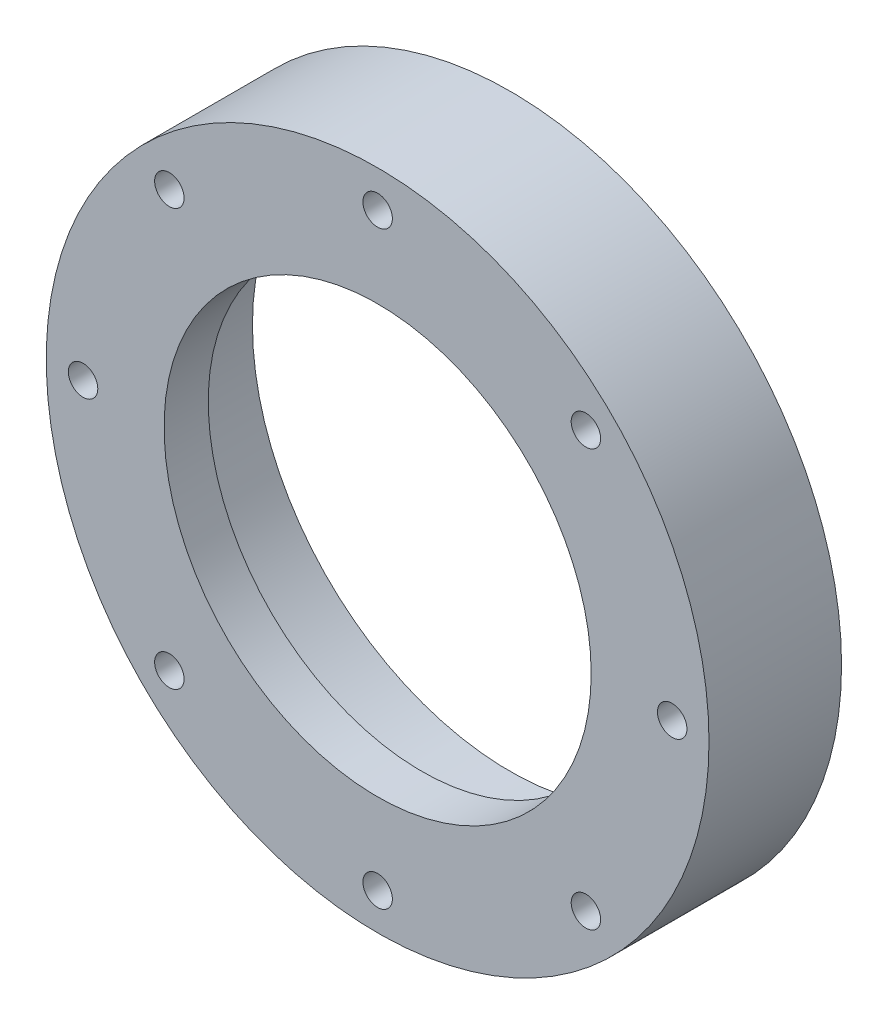
ISO-10303-21;
HEADER;
FILE_DESCRIPTION(('STEP AP214'),'2;1');
FILE_NAME('part.step','',(''),(''),'','','');
FILE_SCHEMA(('AUTOMOTIVE_DESIGN { 1 0 10303 214 1 1 1 1 }'));
ENDSEC;
DATA;
#1=APPLICATION_CONTEXT('core data for automotive mechanical design processes');
#2=APPLICATION_PROTOCOL_DEFINITION('international standard','automotive_design',2000,#1);
#3=PRODUCT_CONTEXT('',#1,'mechanical');
#4=PRODUCT('Part','Part','',(#3));
#5=PRODUCT_RELATED_PRODUCT_CATEGORY('part','',(#4));
#6=PRODUCT_DEFINITION_FORMATION('','',#4);
#7=PRODUCT_DEFINITION_CONTEXT('part definition',#1,'design');
#8=PRODUCT_DEFINITION('design','',#6,#7);
#9=PRODUCT_DEFINITION_SHAPE('','',#8);
#10=(LENGTH_UNIT() NAMED_UNIT(*) SI_UNIT(.MILLI.,.METRE.));
#11=(NAMED_UNIT(*) PLANE_ANGLE_UNIT() SI_UNIT($,.RADIAN.));
#12=(NAMED_UNIT(*) SI_UNIT($,.STERADIAN.) SOLID_ANGLE_UNIT());
#13=UNCERTAINTY_MEASURE_WITH_UNIT(LENGTH_MEASURE(1.E-05),#10,'distance_accuracy_value','');
#14=(GEOMETRIC_REPRESENTATION_CONTEXT(3) GLOBAL_UNCERTAINTY_ASSIGNED_CONTEXT((#13)) GLOBAL_UNIT_ASSIGNED_CONTEXT((#10,
#11,#12)) REPRESENTATION_CONTEXT('',''));
#15=CARTESIAN_POINT('',(0.,0.,0.));
#16=DIRECTION('',(0.,0.,1.));
#17=DIRECTION('',(1.,0.,0.));
#18=AXIS2_PLACEMENT_3D('',#15,#16,#17);
#19=CARTESIAN_POINT('',(0.,0.,0.));
#20=DIRECTION('',(0.,0.,1.));
#21=DIRECTION('',(1.,0.,0.));
#22=AXIS2_PLACEMENT_3D('',#19,#20,#21);
#23=PLANE('',#22);
#24=CARTESIAN_POINT('',(0.,40.,0.));
#25=DIRECTION('',(0.,0.,1.));
#26=DIRECTION('',(1.,0.,0.));
#27=AXIS2_PLACEMENT_3D('',#24,#25,#26);
#28=CIRCLE('',#27,2.);
#29=CARTESIAN_POINT('',(2.,40.,0.));
#30=VERTEX_POINT('',#29);
#31=EDGE_CURVE('E59',#30,#30,#28,.T.);
#32=ORIENTED_EDGE('',*,*,#31,.T.);
#33=EDGE_LOOP('',(#32));
#34=FACE_BOUND('',#33,.T.);
#35=CARTESIAN_POINT('',(28.2842712474619,28.2842712474619,0.));
#36=DIRECTION('',(0.,0.,1.));
#37=DIRECTION('',(1.,0.,0.));
#38=AXIS2_PLACEMENT_3D('',#35,#36,#37);
#39=CIRCLE('',#38,2.00000000000002);
#40=CARTESIAN_POINT('',(30.2842712474619,28.2842712474619,0.));
#41=VERTEX_POINT('',#40);
#42=EDGE_CURVE('E98',#41,#41,#39,.T.);
#43=ORIENTED_EDGE('',*,*,#42,.T.);
#44=EDGE_LOOP('',(#43));
#45=FACE_BOUND('',#44,.T.);
#46=CARTESIAN_POINT('',(40.,0.,0.));
#47=DIRECTION('',(0.,0.,1.));
#48=DIRECTION('',(1.,0.,0.));
#49=AXIS2_PLACEMENT_3D('',#46,#47,#48);
#50=CIRCLE('',#49,2.);
#51=CARTESIAN_POINT('',(42.,0.,0.));
#52=VERTEX_POINT('',#51);
#53=EDGE_CURVE('E92',#52,#52,#50,.T.);
#54=ORIENTED_EDGE('',*,*,#53,.T.);
#55=EDGE_LOOP('',(#54));
#56=FACE_BOUND('',#55,.T.);
#57=CARTESIAN_POINT('',(28.2842712474619,-28.2842712474619,0.));
#58=DIRECTION('',(0.,0.,1.));
#59=DIRECTION('',(1.,0.,0.));
#60=AXIS2_PLACEMENT_3D('',#57,#58,#59);
#61=CIRCLE('',#60,2.);
#62=CARTESIAN_POINT('',(30.2842712474619,-28.2842712474619,0.));
#63=VERTEX_POINT('',#62);
#64=EDGE_CURVE('E86',#63,#63,#61,.T.);
#65=ORIENTED_EDGE('',*,*,#64,.T.);
#66=EDGE_LOOP('',(#65));
#67=FACE_BOUND('',#66,.T.);
#68=CARTESIAN_POINT('',(0.,-40.,0.));
#69=DIRECTION('',(0.,0.,1.));
#70=DIRECTION('',(1.,0.,0.));
#71=AXIS2_PLACEMENT_3D('',#68,#69,#70);
#72=CIRCLE('',#71,2.);
#73=CARTESIAN_POINT('',(2.00000000000001,-40.,0.));
#74=VERTEX_POINT('',#73);
#75=EDGE_CURVE('E80',#74,#74,#72,.T.);
#76=ORIENTED_EDGE('',*,*,#75,.T.);
#77=EDGE_LOOP('',(#76));
#78=FACE_BOUND('',#77,.T.);
#79=CARTESIAN_POINT('',(-28.2842712474619,-28.2842712474619,0.));
#80=DIRECTION('',(0.,0.,1.));
#81=DIRECTION('',(1.,0.,0.));
#82=AXIS2_PLACEMENT_3D('',#79,#80,#81);
#83=CIRCLE('',#82,2.00000000000001);
#84=CARTESIAN_POINT('',(-26.2842712474619,-28.2842712474619,0.));
#85=VERTEX_POINT('',#84);
#86=EDGE_CURVE('E74',#85,#85,#83,.T.);
#87=ORIENTED_EDGE('',*,*,#86,.T.);
#88=EDGE_LOOP('',(#87));
#89=FACE_BOUND('',#88,.T.);
#90=CARTESIAN_POINT('',(-40.,0.,0.));
#91=DIRECTION('',(0.,0.,1.));
#92=DIRECTION('',(1.,0.,0.));
#93=AXIS2_PLACEMENT_3D('',#90,#91,#92);
#94=CIRCLE('',#93,2.);
#95=CARTESIAN_POINT('',(-38.,0.,0.));
#96=VERTEX_POINT('',#95);
#97=EDGE_CURVE('E68',#96,#96,#94,.T.);
#98=ORIENTED_EDGE('',*,*,#97,.T.);
#99=EDGE_LOOP('',(#98));
#100=FACE_BOUND('',#99,.T.);
#101=CARTESIAN_POINT('',(-28.2842712474619,28.2842712474619,0.));
#102=DIRECTION('',(0.,0.,1.));
#103=DIRECTION('',(1.,0.,0.));
#104=AXIS2_PLACEMENT_3D('',#101,#102,#103);
#105=CIRCLE('',#104,2.00000000000001);
#106=CARTESIAN_POINT('',(-26.2842712474619,28.2842712474619,0.));
#107=VERTEX_POINT('',#106);
#108=EDGE_CURVE('E62',#107,#107,#105,.T.);
#109=ORIENTED_EDGE('',*,*,#108,.T.);
#110=EDGE_LOOP('',(#109));
#111=FACE_BOUND('',#110,.T.);
#112=CARTESIAN_POINT('',(0.,0.,0.));
#113=DIRECTION('',(0.,0.,1.));
#114=DIRECTION('',(1.,0.,0.));
#115=AXIS2_PLACEMENT_3D('',#112,#113,#114);
#116=CIRCLE('',#115,45.);
#117=CARTESIAN_POINT('',(45.,0.,0.));
#118=VERTEX_POINT('',#117);
#119=EDGE_CURVE('E10',#118,#118,#116,.T.);
#120=ORIENTED_EDGE('',*,*,#119,.F.);
#121=EDGE_LOOP('',(#120));
#122=FACE_BOUND('',#121,.T.);
#123=CARTESIAN_POINT('',(0.,0.,0.));
#124=DIRECTION('',(0.,0.,1.));
#125=DIRECTION('',(1.,0.,0.));
#126=AXIS2_PLACEMENT_3D('',#123,#124,#125);
#127=CIRCLE('',#126,35.);
#128=CARTESIAN_POINT('',(35.,0.,0.));
#129=VERTEX_POINT('',#128);
#130=EDGE_CURVE('E42',#129,#129,#127,.T.);
#131=ORIENTED_EDGE('',*,*,#130,.T.);
#132=EDGE_LOOP('',(#131));
#133=FACE_BOUND('',#132,.T.);
#134=ADVANCED_FACE('F35',(#34,#45,#56,#67,#78,#89,#100,#111,#122,#133),#23,.F.);
#135=CARTESIAN_POINT('',(0.,0.,12.));
#136=DIRECTION('',(0.,0.,-1.));
#137=DIRECTION('',(-1.,0.,0.));
#138=AXIS2_PLACEMENT_3D('',#135,#136,#137);
#139=CYLINDRICAL_SURFACE('',#138,45.);
#140=ORIENTED_EDGE('',*,*,#119,.T.);
#141=EDGE_LOOP('',(#140));
#142=FACE_BOUND('',#141,.T.);
#143=CARTESIAN_POINT('',(0.,0.,18.));
#144=DIRECTION('',(0.,0.,1.));
#145=DIRECTION('',(1.,0.,0.));
#146=AXIS2_PLACEMENT_3D('',#143,#144,#145);
#147=CIRCLE('',#146,45.);
#148=CARTESIAN_POINT('',(45.,0.,18.));
#149=VERTEX_POINT('',#148);
#150=EDGE_CURVE('E50',#149,#149,#147,.T.);
#151=ORIENTED_EDGE('',*,*,#150,.F.);
#152=EDGE_LOOP('',(#151));
#153=FACE_BOUND('',#152,.T.);
#154=ADVANCED_FACE('F37',(#142,#153),#139,.T.);
#155=CARTESIAN_POINT('',(0.,0.,12.));
#156=DIRECTION('',(0.,0.,-1.));
#157=DIRECTION('',(-1.,0.,0.));
#158=AXIS2_PLACEMENT_3D('',#155,#156,#157);
#159=CYLINDRICAL_SURFACE('',#158,35.);
#160=CARTESIAN_POINT('',(0.,0.,12.));
#161=DIRECTION('',(0.,0.,1.));
#162=DIRECTION('',(1.,0.,0.));
#163=AXIS2_PLACEMENT_3D('',#160,#161,#162);
#164=CIRCLE('',#163,35.);
#165=CARTESIAN_POINT('',(35.,0.,12.));
#166=VERTEX_POINT('',#165);
#167=EDGE_CURVE('E46',#166,#166,#164,.T.);
#168=ORIENTED_EDGE('',*,*,#167,.T.);
#169=EDGE_LOOP('',(#168));
#170=FACE_BOUND('',#169,.T.);
#171=ORIENTED_EDGE('',*,*,#130,.F.);
#172=EDGE_LOOP('',(#171));
#173=FACE_BOUND('',#172,.T.);
#174=ADVANCED_FACE('F151',(#170,#173),#159,.F.);
#175=CARTESIAN_POINT('',(0.,0.,12.));
#176=DIRECTION('',(0.,0.,1.));
#177=DIRECTION('',(1.,0.,0.));
#178=AXIS2_PLACEMENT_3D('',#175,#176,#177);
#179=PLANE('',#178);
#180=CARTESIAN_POINT('',(0.,0.,12.));
#181=DIRECTION('',(0.,0.,1.));
#182=DIRECTION('',(1.,0.,0.));
#183=AXIS2_PLACEMENT_3D('',#180,#181,#182);
#184=CIRCLE('',#183,29.);
#185=CARTESIAN_POINT('',(29.,0.,12.));
#186=VERTEX_POINT('',#185);
#187=EDGE_CURVE('E56',#186,#186,#184,.T.);
#188=ORIENTED_EDGE('',*,*,#187,.T.);
#189=EDGE_LOOP('',(#188));
#190=FACE_BOUND('',#189,.T.);
#191=ORIENTED_EDGE('',*,*,#167,.F.);
#192=EDGE_LOOP('',(#191));
#193=FACE_BOUND('',#192,.T.);
#194=ADVANCED_FACE('F123',(#190,#193),#179,.F.);
#195=CARTESIAN_POINT('',(0.,0.,18.));
#196=DIRECTION('',(0.,0.,1.));
#197=DIRECTION('',(1.,0.,0.));
#198=AXIS2_PLACEMENT_3D('',#195,#196,#197);
#199=PLANE('',#198);
#200=CARTESIAN_POINT('',(0.,40.,18.));
#201=DIRECTION('',(0.,0.,1.));
#202=DIRECTION('',(1.,0.,0.));
#203=AXIS2_PLACEMENT_3D('',#200,#201,#202);
#204=CIRCLE('',#203,2.);
#205=CARTESIAN_POINT('',(2.,40.,18.));
#206=VERTEX_POINT('',#205);
#207=EDGE_CURVE('E104',#206,#206,#204,.T.);
#208=ORIENTED_EDGE('',*,*,#207,.F.);
#209=EDGE_LOOP('',(#208));
#210=FACE_BOUND('',#209,.T.);
#211=CARTESIAN_POINT('',(28.2842712474619,28.2842712474619,18.));
#212=DIRECTION('',(0.,0.,1.));
#213=DIRECTION('',(1.,0.,0.));
#214=AXIS2_PLACEMENT_3D('',#211,#212,#213);
#215=CIRCLE('',#214,2.00000000000002);
#216=CARTESIAN_POINT('',(30.2842712474619,28.2842712474619,18.));
#217=VERTEX_POINT('',#216);
#218=EDGE_CURVE('E101',#217,#217,#215,.T.);
#219=ORIENTED_EDGE('',*,*,#218,.F.);
#220=EDGE_LOOP('',(#219));
#221=FACE_BOUND('',#220,.T.);
#222=CARTESIAN_POINT('',(40.,0.,18.));
#223=DIRECTION('',(0.,0.,1.));
#224=DIRECTION('',(1.,0.,0.));
#225=AXIS2_PLACEMENT_3D('',#222,#223,#224);
#226=CIRCLE('',#225,2.);
#227=CARTESIAN_POINT('',(42.,0.,18.));
#228=VERTEX_POINT('',#227);
#229=EDGE_CURVE('E95',#228,#228,#226,.T.);
#230=ORIENTED_EDGE('',*,*,#229,.F.);
#231=EDGE_LOOP('',(#230));
#232=FACE_BOUND('',#231,.T.);
#233=CARTESIAN_POINT('',(28.2842712474619,-28.2842712474619,18.));
#234=DIRECTION('',(0.,0.,1.));
#235=DIRECTION('',(1.,0.,0.));
#236=AXIS2_PLACEMENT_3D('',#233,#234,#235);
#237=CIRCLE('',#236,2.);
#238=CARTESIAN_POINT('',(30.2842712474619,-28.2842712474619,18.));
#239=VERTEX_POINT('',#238);
#240=EDGE_CURVE('E89',#239,#239,#237,.T.);
#241=ORIENTED_EDGE('',*,*,#240,.F.);
#242=EDGE_LOOP('',(#241));
#243=FACE_BOUND('',#242,.T.);
#244=CARTESIAN_POINT('',(0.,-40.,18.));
#245=DIRECTION('',(0.,0.,1.));
#246=DIRECTION('',(1.,0.,0.));
#247=AXIS2_PLACEMENT_3D('',#244,#245,#246);
#248=CIRCLE('',#247,2.);
#249=CARTESIAN_POINT('',(2.00000000000001,-40.,18.));
#250=VERTEX_POINT('',#249);
#251=EDGE_CURVE('E83',#250,#250,#248,.T.);
#252=ORIENTED_EDGE('',*,*,#251,.F.);
#253=EDGE_LOOP('',(#252));
#254=FACE_BOUND('',#253,.T.);
#255=CARTESIAN_POINT('',(-28.2842712474619,-28.2842712474619,18.));
#256=DIRECTION('',(0.,0.,1.));
#257=DIRECTION('',(1.,0.,0.));
#258=AXIS2_PLACEMENT_3D('',#255,#256,#257);
#259=CIRCLE('',#258,2.00000000000001);
#260=CARTESIAN_POINT('',(-26.2842712474619,-28.2842712474619,18.));
#261=VERTEX_POINT('',#260);
#262=EDGE_CURVE('E77',#261,#261,#259,.T.);
#263=ORIENTED_EDGE('',*,*,#262,.F.);
#264=EDGE_LOOP('',(#263));
#265=FACE_BOUND('',#264,.T.);
#266=CARTESIAN_POINT('',(-40.,0.,18.));
#267=DIRECTION('',(0.,0.,1.));
#268=DIRECTION('',(1.,0.,0.));
#269=AXIS2_PLACEMENT_3D('',#266,#267,#268);
#270=CIRCLE('',#269,2.);
#271=CARTESIAN_POINT('',(-38.,0.,18.));
#272=VERTEX_POINT('',#271);
#273=EDGE_CURVE('E71',#272,#272,#270,.T.);
#274=ORIENTED_EDGE('',*,*,#273,.F.);
#275=EDGE_LOOP('',(#274));
#276=FACE_BOUND('',#275,.T.);
#277=CARTESIAN_POINT('',(-28.2842712474619,28.2842712474619,18.));
#278=DIRECTION('',(0.,0.,1.));
#279=DIRECTION('',(1.,0.,0.));
#280=AXIS2_PLACEMENT_3D('',#277,#278,#279);
#281=CIRCLE('',#280,2.00000000000001);
#282=CARTESIAN_POINT('',(-26.2842712474619,28.2842712474619,18.));
#283=VERTEX_POINT('',#282);
#284=EDGE_CURVE('E65',#283,#283,#281,.T.);
#285=ORIENTED_EDGE('',*,*,#284,.F.);
#286=EDGE_LOOP('',(#285));
#287=FACE_BOUND('',#286,.T.);
#288=ORIENTED_EDGE('',*,*,#150,.T.);
#289=EDGE_LOOP('',(#288));
#290=FACE_BOUND('',#289,.T.);
#291=CARTESIAN_POINT('',(0.,0.,18.));
#292=DIRECTION('',(0.,0.,1.));
#293=DIRECTION('',(1.,0.,0.));
#294=AXIS2_PLACEMENT_3D('',#291,#292,#293);
#295=CIRCLE('',#294,29.);
#296=CARTESIAN_POINT('',(29.,0.,18.));
#297=VERTEX_POINT('',#296);
#298=EDGE_CURVE('E55',#297,#297,#295,.T.);
#299=ORIENTED_EDGE('',*,*,#298,.F.);
#300=EDGE_LOOP('',(#299));
#301=FACE_BOUND('',#300,.T.);
#302=ADVANCED_FACE('F119',(#210,#221,#232,#243,#254,#265,#276,#287,#290,#301),#199,.T.);
#303=CARTESIAN_POINT('',(0.,0.,18.));
#304=DIRECTION('',(0.,0.,-1.));
#305=DIRECTION('',(-1.,0.,0.));
#306=AXIS2_PLACEMENT_3D('',#303,#304,#305);
#307=CYLINDRICAL_SURFACE('',#306,29.);
#308=ORIENTED_EDGE('',*,*,#298,.T.);
#309=EDGE_LOOP('',(#308));
#310=FACE_BOUND('',#309,.T.);
#311=ORIENTED_EDGE('',*,*,#187,.F.);
#312=EDGE_LOOP('',(#311));
#313=FACE_BOUND('',#312,.T.);
#314=ADVANCED_FACE('F122',(#310,#313),#307,.F.);
#315=CARTESIAN_POINT('',(-28.2842712474619,28.2842712474619,0.));
#316=DIRECTION('',(0.,0.,1.));
#317=DIRECTION('',(1.,0.,0.));
#318=AXIS2_PLACEMENT_3D('',#315,#316,#317);
#319=CYLINDRICAL_SURFACE('',#318,2.00000000000001);
#320=ORIENTED_EDGE('',*,*,#108,.F.);
#321=EDGE_LOOP('',(#320));
#322=FACE_BOUND('',#321,.T.);
#323=ORIENTED_EDGE('',*,*,#284,.T.);
#324=EDGE_LOOP('',(#323));
#325=FACE_BOUND('',#324,.T.);
#326=ADVANCED_FACE('F145',(#322,#325),#319,.F.);
#327=CARTESIAN_POINT('',(-40.,0.,0.));
#328=DIRECTION('',(0.,0.,1.));
#329=DIRECTION('',(1.,0.,0.));
#330=AXIS2_PLACEMENT_3D('',#327,#328,#329);
#331=CYLINDRICAL_SURFACE('',#330,2.);
#332=ORIENTED_EDGE('',*,*,#97,.F.);
#333=EDGE_LOOP('',(#332));
#334=FACE_BOUND('',#333,.T.);
#335=ORIENTED_EDGE('',*,*,#273,.T.);
#336=EDGE_LOOP('',(#335));
#337=FACE_BOUND('',#336,.T.);
#338=ADVANCED_FACE('F197',(#334,#337),#331,.F.);
#339=CARTESIAN_POINT('',(-28.2842712474619,-28.2842712474619,0.));
#340=DIRECTION('',(0.,0.,1.));
#341=DIRECTION('',(1.,0.,0.));
#342=AXIS2_PLACEMENT_3D('',#339,#340,#341);
#343=CYLINDRICAL_SURFACE('',#342,2.00000000000001);
#344=ORIENTED_EDGE('',*,*,#86,.F.);
#345=EDGE_LOOP('',(#344));
#346=FACE_BOUND('',#345,.T.);
#347=ORIENTED_EDGE('',*,*,#262,.T.);
#348=EDGE_LOOP('',(#347));
#349=FACE_BOUND('',#348,.T.);
#350=ADVANCED_FACE('F204',(#346,#349),#343,.F.);
#351=CARTESIAN_POINT('',(0.,-40.,0.));
#352=DIRECTION('',(0.,0.,1.));
#353=DIRECTION('',(1.,0.,0.));
#354=AXIS2_PLACEMENT_3D('',#351,#352,#353);
#355=CYLINDRICAL_SURFACE('',#354,2.);
#356=ORIENTED_EDGE('',*,*,#75,.F.);
#357=EDGE_LOOP('',(#356));
#358=FACE_BOUND('',#357,.T.);
#359=ORIENTED_EDGE('',*,*,#251,.T.);
#360=EDGE_LOOP('',(#359));
#361=FACE_BOUND('',#360,.T.);
#362=ADVANCED_FACE('F212',(#358,#361),#355,.F.);
#363=CARTESIAN_POINT('',(28.2842712474619,-28.2842712474619,0.));
#364=DIRECTION('',(0.,0.,1.));
#365=DIRECTION('',(1.,0.,0.));
#366=AXIS2_PLACEMENT_3D('',#363,#364,#365);
#367=CYLINDRICAL_SURFACE('',#366,2.);
#368=ORIENTED_EDGE('',*,*,#64,.F.);
#369=EDGE_LOOP('',(#368));
#370=FACE_BOUND('',#369,.T.);
#371=ORIENTED_EDGE('',*,*,#240,.T.);
#372=EDGE_LOOP('',(#371));
#373=FACE_BOUND('',#372,.T.);
#374=ADVANCED_FACE('F220',(#370,#373),#367,.F.);
#375=CARTESIAN_POINT('',(40.,0.,0.));
#376=DIRECTION('',(0.,0.,1.));
#377=DIRECTION('',(1.,0.,0.));
#378=AXIS2_PLACEMENT_3D('',#375,#376,#377);
#379=CYLINDRICAL_SURFACE('',#378,2.);
#380=ORIENTED_EDGE('',*,*,#53,.F.);
#381=EDGE_LOOP('',(#380));
#382=FACE_BOUND('',#381,.T.);
#383=ORIENTED_EDGE('',*,*,#229,.T.);
#384=EDGE_LOOP('',(#383));
#385=FACE_BOUND('',#384,.T.);
#386=ADVANCED_FACE('F228',(#382,#385),#379,.F.);
#387=CARTESIAN_POINT('',(28.2842712474619,28.2842712474619,0.));
#388=DIRECTION('',(0.,0.,1.));
#389=DIRECTION('',(1.,0.,0.));
#390=AXIS2_PLACEMENT_3D('',#387,#388,#389);
#391=CYLINDRICAL_SURFACE('',#390,2.00000000000002);
#392=ORIENTED_EDGE('',*,*,#42,.F.);
#393=EDGE_LOOP('',(#392));
#394=FACE_BOUND('',#393,.T.);
#395=ORIENTED_EDGE('',*,*,#218,.T.);
#396=EDGE_LOOP('',(#395));
#397=FACE_BOUND('',#396,.T.);
#398=ADVANCED_FACE('F115',(#394,#397),#391,.F.);
#399=CARTESIAN_POINT('',(0.,40.,0.));
#400=DIRECTION('',(0.,0.,1.));
#401=DIRECTION('',(1.,0.,0.));
#402=AXIS2_PLACEMENT_3D('',#399,#400,#401);
#403=CYLINDRICAL_SURFACE('',#402,2.);
#404=ORIENTED_EDGE('',*,*,#31,.F.);
#405=EDGE_LOOP('',(#404));
#406=FACE_BOUND('',#405,.T.);
#407=ORIENTED_EDGE('',*,*,#207,.T.);
#408=EDGE_LOOP('',(#407));
#409=FACE_BOUND('',#408,.T.);
#410=ADVANCED_FACE('F112',(#406,#409),#403,.F.);
#411=CLOSED_SHELL('',(#134,#154,#174,#194,#302,#314,#326,#338,#350,#362,#374,#386,#398,#410));
#412=MANIFOLD_SOLID_BREP('B2',#411);
#413=ADVANCED_BREP_SHAPE_REPRESENTATION('',(#18,#412),#14);
#414=SHAPE_DEFINITION_REPRESENTATION(#9,#413);
ENDSEC;
END-ISO-10303-21;
